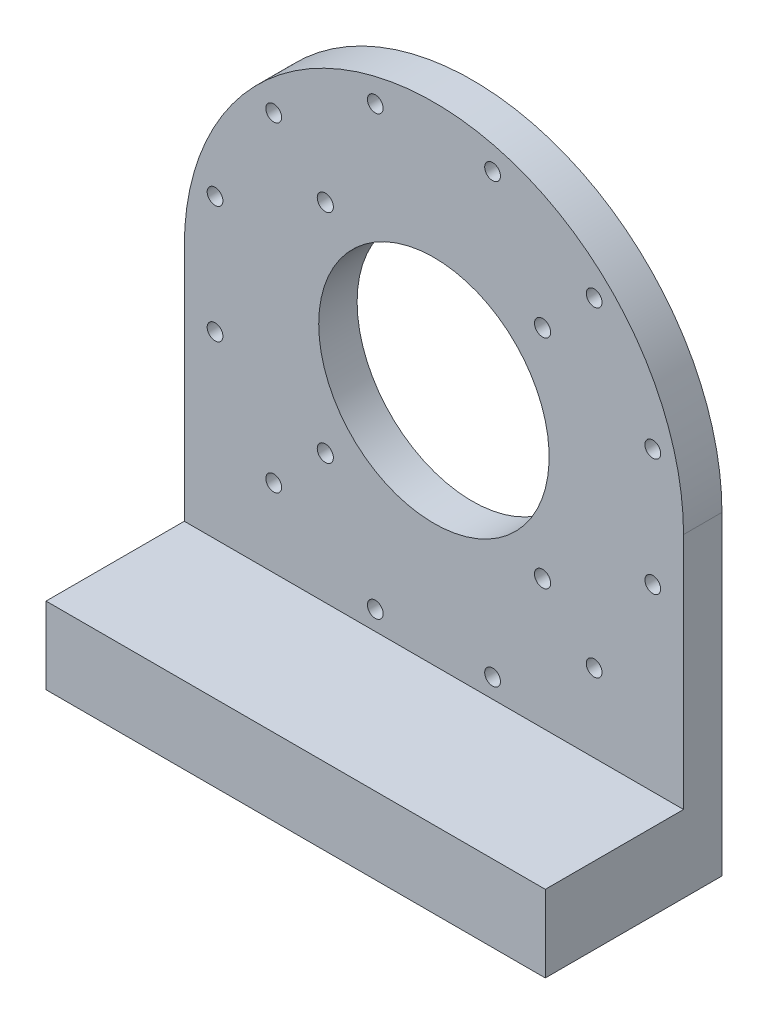
ISO-10303-21;
HEADER;
FILE_DESCRIPTION(('STEP AP214'),'2;1');
FILE_NAME('part.step','',(''),(''),'','','');
FILE_SCHEMA(('AUTOMOTIVE_DESIGN { 1 0 10303 214 1 1 1 1 }'));
ENDSEC;
DATA;
#1=APPLICATION_CONTEXT('core data for automotive mechanical design processes');
#2=APPLICATION_PROTOCOL_DEFINITION('international standard','automotive_design',2000,#1);
#3=PRODUCT_CONTEXT('',#1,'mechanical');
#4=PRODUCT('Part','Part','',(#3));
#5=PRODUCT_RELATED_PRODUCT_CATEGORY('part','',(#4));
#6=PRODUCT_DEFINITION_FORMATION('','',#4);
#7=PRODUCT_DEFINITION_CONTEXT('part definition',#1,'design');
#8=PRODUCT_DEFINITION('design','',#6,#7);
#9=PRODUCT_DEFINITION_SHAPE('','',#8);
#10=(LENGTH_UNIT() NAMED_UNIT(*) SI_UNIT(.MILLI.,.METRE.));
#11=(NAMED_UNIT(*) PLANE_ANGLE_UNIT() SI_UNIT($,.RADIAN.));
#12=(NAMED_UNIT(*) SI_UNIT($,.STERADIAN.) SOLID_ANGLE_UNIT());
#13=UNCERTAINTY_MEASURE_WITH_UNIT(LENGTH_MEASURE(1.E-05),#10,'distance_accuracy_value','');
#14=(GEOMETRIC_REPRESENTATION_CONTEXT(3) GLOBAL_UNCERTAINTY_ASSIGNED_CONTEXT((#13)) GLOBAL_UNIT_ASSIGNED_CONTEXT((#10,
#11,#12)) REPRESENTATION_CONTEXT('',''));
#15=CARTESIAN_POINT('',(0.,0.,0.));
#16=DIRECTION('',(0.,0.,1.));
#17=DIRECTION('',(1.,0.,0.));
#18=AXIS2_PLACEMENT_3D('',#15,#16,#17);
#19=CARTESIAN_POINT('',(0.,0.,-97.507071392975));
#20=DIRECTION('',(0.,0.,-1.));
#21=DIRECTION('',(-1.,0.,0.));
#22=AXIS2_PLACEMENT_3D('',#19,#20,#21);
#23=PLANE('',#22);
#24=CARTESIAN_POINT('',(47.3534927311799,88.9780084105045,-97.507071392975));
#25=DIRECTION('',(0.,0.,-1.));
#26=DIRECTION('',(-1.,0.,0.));
#27=AXIS2_PLACEMENT_3D('',#24,#25,#26);
#28=CIRCLE('',#27,2.05);
#29=CARTESIAN_POINT('',(45.3034927311799,88.9780084105045,-97.507071392975));
#30=VERTEX_POINT('',#29);
#31=EDGE_CURVE('E403',#30,#30,#28,.T.);
#32=ORIENTED_EDGE('',*,*,#31,.T.);
#33=EDGE_LOOP('',(#32));
#34=FACE_BOUND('',#33,.T.);
#35=CARTESIAN_POINT('',(32.0831690701311,62.5290319815478,-97.507071392975));
#36=DIRECTION('',(0.,0.,-1.));
#37=DIRECTION('',(-1.,0.,0.));
#38=AXIS2_PLACEMENT_3D('',#35,#36,#37);
#39=CIRCLE('',#38,2.05);
#40=CARTESIAN_POINT('',(30.0331690701311,62.5290319815478,-97.507071392975));
#41=VERTEX_POINT('',#40);
#42=EDGE_CURVE('E405',#41,#41,#39,.T.);
#43=ORIENTED_EDGE('',*,*,#42,.T.);
#44=EDGE_LOOP('',(#43));
#45=FACE_BOUND('',#44,.T.);
#46=CARTESIAN_POINT('',(32.0831690701306,31.9883846594511,-97.507071392975));
#47=DIRECTION('',(0.,0.,-1.));
#48=DIRECTION('',(-1.,0.,0.));
#49=AXIS2_PLACEMENT_3D('',#46,#47,#48);
#50=CIRCLE('',#49,2.05);
#51=CARTESIAN_POINT('',(30.0331690701306,31.9883846594511,-97.507071392975));
#52=VERTEX_POINT('',#51);
#53=EDGE_CURVE('E409',#52,#52,#50,.T.);
#54=ORIENTED_EDGE('',*,*,#53,.T.);
#55=EDGE_LOOP('',(#54));
#56=FACE_BOUND('',#55,.T.);
#57=CARTESIAN_POINT('',(47.3534927311785,5.53940823049389,-97.507071392975));
#58=DIRECTION('',(0.,0.,-1.));
#59=DIRECTION('',(-1.,0.,0.));
#60=AXIS2_PLACEMENT_3D('',#57,#58,#59);
#61=CIRCLE('',#60,2.04999999999999);
#62=CARTESIAN_POINT('',(45.3034927311785,5.53940823049389,-97.507071392975));
#63=VERTEX_POINT('',#62);
#64=EDGE_CURVE('E414',#63,#63,#61,.T.);
#65=ORIENTED_EDGE('',*,*,#64,.T.);
#66=EDGE_LOOP('',(#65));
#67=FACE_BOUND('',#66,.T.);
#68=CARTESIAN_POINT('',(73.8024691601352,-9.73091543055491,-97.507071392975));
#69=DIRECTION('',(0.,0.,-1.));
#70=DIRECTION('',(-1.,0.,0.));
#71=AXIS2_PLACEMENT_3D('',#68,#69,#70);
#72=CIRCLE('',#71,2.04999999999999);
#73=CARTESIAN_POINT('',(71.7524691601352,-9.73091543055491,-97.507071392975));
#74=VERTEX_POINT('',#73);
#75=EDGE_CURVE('E417',#74,#74,#72,.T.);
#76=ORIENTED_EDGE('',*,*,#75,.T.);
#77=EDGE_LOOP('',(#76));
#78=FACE_BOUND('',#77,.T.);
#79=CARTESIAN_POINT('',(104.343116482232,-9.73091543055543,-97.507071392975));
#80=DIRECTION('',(0.,0.,-1.));
#81=DIRECTION('',(-1.,0.,0.));
#82=AXIS2_PLACEMENT_3D('',#79,#80,#81);
#83=CIRCLE('',#82,2.04999999999999);
#84=CARTESIAN_POINT('',(102.293116482232,-9.73091543055543,-97.507071392975));
#85=VERTEX_POINT('',#84);
#86=EDGE_CURVE('E420',#85,#85,#83,.T.);
#87=ORIENTED_EDGE('',*,*,#86,.T.);
#88=EDGE_LOOP('',(#87));
#89=FACE_BOUND('',#88,.T.);
#90=CARTESIAN_POINT('',(130.792092911189,5.53940823049248,-97.507071392975));
#91=DIRECTION('',(0.,0.,-1.));
#92=DIRECTION('',(-1.,0.,0.));
#93=AXIS2_PLACEMENT_3D('',#90,#91,#92);
#94=CIRCLE('',#93,2.04999999999999);
#95=CARTESIAN_POINT('',(128.742092911189,5.53940823049248,-97.507071392975));
#96=VERTEX_POINT('',#95);
#97=EDGE_CURVE('E423',#96,#96,#94,.T.);
#98=ORIENTED_EDGE('',*,*,#97,.T.);
#99=EDGE_LOOP('',(#98));
#100=FACE_BOUND('',#99,.T.);
#101=CARTESIAN_POINT('',(146.062416572238,31.9883846594491,-97.507071392975));
#102=DIRECTION('',(0.,0.,-1.));
#103=DIRECTION('',(-1.,0.,0.));
#104=AXIS2_PLACEMENT_3D('',#101,#102,#103);
#105=CIRCLE('',#104,2.04999999999999);
#106=CARTESIAN_POINT('',(144.012416572238,31.9883846594491,-97.507071392975));
#107=VERTEX_POINT('',#106);
#108=EDGE_CURVE('E426',#107,#107,#105,.T.);
#109=ORIENTED_EDGE('',*,*,#108,.T.);
#110=EDGE_LOOP('',(#109));
#111=FACE_BOUND('',#110,.T.);
#112=CARTESIAN_POINT('',(146.062416572238,62.5290319815459,-97.507071392975));
#113=DIRECTION('',(0.,0.,-1.));
#114=DIRECTION('',(-1.,0.,0.));
#115=AXIS2_PLACEMENT_3D('',#112,#113,#114);
#116=CIRCLE('',#115,2.04999999999999);
#117=CARTESIAN_POINT('',(144.012416572238,62.5290319815459,-97.507071392975));
#118=VERTEX_POINT('',#117);
#119=EDGE_CURVE('E429',#118,#118,#116,.T.);
#120=ORIENTED_EDGE('',*,*,#119,.T.);
#121=EDGE_LOOP('',(#120));
#122=FACE_BOUND('',#121,.T.);
#123=CARTESIAN_POINT('',(130.792092911191,88.9780084105031,-97.507071392975));
#124=DIRECTION('',(0.,0.,-1.));
#125=DIRECTION('',(-1.,0.,0.));
#126=AXIS2_PLACEMENT_3D('',#123,#124,#125);
#127=CIRCLE('',#126,2.04999999999999);
#128=CARTESIAN_POINT('',(128.742092911191,88.9780084105031,-97.507071392975));
#129=VERTEX_POINT('',#128);
#130=EDGE_CURVE('E432',#129,#129,#127,.T.);
#131=ORIENTED_EDGE('',*,*,#130,.T.);
#132=EDGE_LOOP('',(#131));
#133=FACE_BOUND('',#132,.T.);
#134=CARTESIAN_POINT('',(104.343116482234,104.248332071552,-97.507071392975));
#135=DIRECTION('',(0.,0.,-1.));
#136=DIRECTION('',(-1.,0.,0.));
#137=AXIS2_PLACEMENT_3D('',#134,#135,#136);
#138=CIRCLE('',#137,2.04999999999999);
#139=CARTESIAN_POINT('',(102.293116482234,104.248332071552,-97.507071392975));
#140=VERTEX_POINT('',#139);
#141=EDGE_CURVE('E435',#140,#140,#138,.T.);
#142=ORIENTED_EDGE('',*,*,#141,.T.);
#143=EDGE_LOOP('',(#142));
#144=FACE_BOUND('',#143,.T.);
#145=CARTESIAN_POINT('',(73.8024691601371,104.248332071552,-97.507071392975));
#146=DIRECTION('',(0.,0.,-1.));
#147=DIRECTION('',(-1.,0.,0.));
#148=AXIS2_PLACEMENT_3D('',#145,#146,#147);
#149=CIRCLE('',#148,2.04999999999999);
#150=CARTESIAN_POINT('',(71.7524691601371,104.248332071552,-97.507071392975));
#151=VERTEX_POINT('',#150);
#152=EDGE_CURVE('E438',#151,#151,#149,.T.);
#153=ORIENTED_EDGE('',*,*,#152,.T.);
#154=EDGE_LOOP('',(#153));
#155=FACE_BOUND('',#154,.T.);
#156=CARTESIAN_POINT('',(89.0727928211845,47.2587083204985,-97.507071392975));
#157=DIRECTION('',(0.,0.,-1.));
#158=DIRECTION('',(-1.,0.,0.));
#159=AXIS2_PLACEMENT_3D('',#156,#157,#158);
#160=CIRCLE('',#159,30.);
#161=CARTESIAN_POINT('',(59.0727928211845,47.2587083204985,-97.507071392975));
#162=VERTEX_POINT('',#161);
#163=EDGE_CURVE('E125',#162,#162,#160,.T.);
#164=ORIENTED_EDGE('',*,*,#163,.T.);
#165=EDGE_LOOP('',(#164));
#166=FACE_BOUND('',#165,.T.);
#167=CARTESIAN_POINT('',(60.788521573722,18.9744370730372,-97.507071392975));
#168=DIRECTION('',(0.,0.,-1.));
#169=DIRECTION('',(-1.,0.,0.));
#170=AXIS2_PLACEMENT_3D('',#167,#168,#169);
#171=CIRCLE('',#170,2.1);
#172=CARTESIAN_POINT('',(58.688521573722,18.9744370730372,-97.507071392975));
#173=VERTEX_POINT('',#172);
#174=EDGE_CURVE('E137',#173,#173,#171,.F.);
#175=ORIENTED_EDGE('',*,*,#174,.F.);
#176=EDGE_LOOP('',(#175));
#177=FACE_BOUND('',#176,.T.);
#178=CARTESIAN_POINT('',(117.357064068646,75.5429795679604,-97.507071392975));
#179=DIRECTION('',(0.,0.,-1.));
#180=DIRECTION('',(-1.,0.,0.));
#181=AXIS2_PLACEMENT_3D('',#178,#179,#180);
#182=CIRCLE('',#181,2.1);
#183=CARTESIAN_POINT('',(115.257064068646,75.5429795679604,-97.507071392975));
#184=VERTEX_POINT('',#183);
#185=EDGE_CURVE('E164',#184,#184,#182,.F.);
#186=ORIENTED_EDGE('',*,*,#185,.F.);
#187=EDGE_LOOP('',(#186));
#188=FACE_BOUND('',#187,.T.);
#189=CARTESIAN_POINT('',(60.7885215737225,75.5429795679611,-97.507071392975));
#190=DIRECTION('',(0.,0.,-1.));
#191=DIRECTION('',(-1.,0.,0.));
#192=AXIS2_PLACEMENT_3D('',#189,#190,#191);
#193=CIRCLE('',#192,2.1);
#194=CARTESIAN_POINT('',(58.6885215737225,75.5429795679611,-97.507071392975));
#195=VERTEX_POINT('',#194);
#196=EDGE_CURVE('E161',#195,#195,#193,.F.);
#197=ORIENTED_EDGE('',*,*,#196,.F.);
#198=EDGE_LOOP('',(#197));
#199=FACE_BOUND('',#198,.T.);
#200=CARTESIAN_POINT('',(117.357064068646,18.9744370730369,-97.507071392975));
#201=DIRECTION('',(0.,0.,-1.));
#202=DIRECTION('',(-1.,0.,0.));
#203=AXIS2_PLACEMENT_3D('',#200,#201,#202);
#204=CIRCLE('',#203,2.1);
#205=CARTESIAN_POINT('',(115.257064068646,18.9744370730369,-97.507071392975));
#206=VERTEX_POINT('',#205);
#207=EDGE_CURVE('E158',#206,#206,#204,.F.);
#208=ORIENTED_EDGE('',*,*,#207,.F.);
#209=EDGE_LOOP('',(#208));
#210=FACE_BOUND('',#209,.T.);
#211=DIRECTION('',(-1.,0.,0.));
#212=VECTOR('',#211,1.);
#213=CARTESIAN_POINT('',(0.,-14.7412916795015,-97.507071392975));
#214=LINE('',#213,#212);
#215=CARTESIAN_POINT('',(154.072792821184,-14.7412916795015,-97.507071392975));
#216=VERTEX_POINT('',#215);
#217=CARTESIAN_POINT('',(24.0727928211845,-14.7412916795015,-97.507071392975));
#218=VERTEX_POINT('',#217);
#219=EDGE_CURVE('E56',#216,#218,#214,.T.);
#220=ORIENTED_EDGE('',*,*,#219,.F.);
#221=DIRECTION('',(0.,-1.,0.));
#222=VECTOR('',#221,1.);
#223=CARTESIAN_POINT('',(154.072792821184,0.,-97.507071392975));
#224=LINE('',#223,#222);
#225=CARTESIAN_POINT('',(154.072792821185,47.2587083204985,-97.507071392975));
#226=VERTEX_POINT('',#225);
#227=EDGE_CURVE('E156',#226,#216,#224,.T.);
#228=ORIENTED_EDGE('',*,*,#227,.F.);
#229=CARTESIAN_POINT('',(89.0727928211845,47.2587083204985,-97.507071392975));
#230=DIRECTION('',(0.,0.,-1.));
#231=DIRECTION('',(-1.,0.,0.));
#232=AXIS2_PLACEMENT_3D('',#229,#230,#231);
#233=CIRCLE('',#232,65.);
#234=CARTESIAN_POINT('',(24.0727928211845,47.2587083204985,-97.507071392975));
#235=VERTEX_POINT('',#234);
#236=EDGE_CURVE('E79',#235,#226,#233,.T.);
#237=ORIENTED_EDGE('',*,*,#236,.F.);
#238=DIRECTION('',(0.,-1.,0.));
#239=VECTOR('',#238,1.);
#240=CARTESIAN_POINT('',(24.0727928211845,0.,-97.507071392975));
#241=LINE('',#240,#239);
#242=EDGE_CURVE('E132',#235,#218,#241,.T.);
#243=ORIENTED_EDGE('',*,*,#242,.T.);
#244=EDGE_LOOP('',(#220,#228,#237,#243));
#245=FACE_BOUND('',#244,.T.);
#246=ADVANCED_FACE('F41',(#34,#45,#56,#67,#78,#89,#100,#111,#122,#133,#144,#155,#166,#177,#188,
#199,#210,#245),#23,.F.);
#247=CARTESIAN_POINT('',(24.0727928211845,0.,-107.507071392975));
#248=DIRECTION('',(-1.,0.,0.));
#249=DIRECTION('',(0.,-1.,0.));
#250=AXIS2_PLACEMENT_3D('',#247,#248,#249);
#251=PLANE('',#250);
#252=ORIENTED_EDGE('',*,*,#242,.F.);
#253=DIRECTION('',(0.,0.,1.));
#254=VECTOR('',#253,1.);
#255=CARTESIAN_POINT('',(24.0727928211845,47.2587083204985,-107.507071392975));
#256=LINE('',#255,#254);
#257=CARTESIAN_POINT('',(24.0727928211845,47.2587083204985,-107.507071392975));
#258=VERTEX_POINT('',#257);
#259=EDGE_CURVE('E11',#258,#235,#256,.T.);
#260=ORIENTED_EDGE('',*,*,#259,.F.);
#261=DIRECTION('',(0.,-1.,0.));
#262=VECTOR('',#261,1.);
#263=CARTESIAN_POINT('',(24.0727928211845,0.,-107.507071392975));
#264=LINE('',#263,#262);
#265=CARTESIAN_POINT('',(24.0727928211845,-34.7412916795015,-107.507071392975));
#266=VERTEX_POINT('',#265);
#267=EDGE_CURVE('E134',#258,#266,#264,.T.);
#268=ORIENTED_EDGE('',*,*,#267,.T.);
#269=DIRECTION('',(0.,0.,1.));
#270=VECTOR('',#269,1.);
#271=CARTESIAN_POINT('',(24.0727928211845,-34.7412916795015,-107.507071392975));
#272=LINE('',#271,#270);
#273=CARTESIAN_POINT('',(24.0727928211845,-34.7412916795015,-61.507071392975));
#274=VERTEX_POINT('',#273);
#275=EDGE_CURVE('E123',#266,#274,#272,.T.);
#276=ORIENTED_EDGE('',*,*,#275,.T.);
#277=DIRECTION('',(0.,-1.,0.));
#278=VECTOR('',#277,1.);
#279=CARTESIAN_POINT('',(24.0727928211845,0.,-61.507071392975));
#280=LINE('',#279,#278);
#281=CARTESIAN_POINT('',(24.0727928211845,-14.7412916795015,-61.507071392975));
#282=VERTEX_POINT('',#281);
#283=EDGE_CURVE('E110',#282,#274,#280,.T.);
#284=ORIENTED_EDGE('',*,*,#283,.F.);
#285=DIRECTION('',(0.,0.,-1.));
#286=VECTOR('',#285,1.);
#287=CARTESIAN_POINT('',(24.0727928211845,-14.7412916795015,-61.507071392975));
#288=LINE('',#287,#286);
#289=EDGE_CURVE('E118',#282,#218,#288,.T.);
#290=ORIENTED_EDGE('',*,*,#289,.T.);
#291=EDGE_LOOP('',(#252,#260,#268,#276,#284,#290));
#292=FACE_BOUND('',#291,.T.);
#293=ADVANCED_FACE('F43',(#292),#251,.T.);
#294=CARTESIAN_POINT('',(89.0727928211845,47.2587083204985,-107.507071392975));
#295=DIRECTION('',(0.,0.,1.));
#296=DIRECTION('',(1.,0.,0.));
#297=AXIS2_PLACEMENT_3D('',#294,#295,#296);
#298=CYLINDRICAL_SURFACE('',#297,65.);
#299=ORIENTED_EDGE('',*,*,#236,.T.);
#300=DIRECTION('',(0.,0.,1.));
#301=VECTOR('',#300,1.);
#302=CARTESIAN_POINT('',(154.072792821185,47.2587083204985,-107.507071392975));
#303=LINE('',#302,#301);
#304=CARTESIAN_POINT('',(154.072792821185,47.2587083204985,-107.507071392975));
#305=VERTEX_POINT('',#304);
#306=EDGE_CURVE('E49',#305,#226,#303,.T.);
#307=ORIENTED_EDGE('',*,*,#306,.F.);
#308=CARTESIAN_POINT('',(89.0727928211845,47.2587083204985,-107.507071392975));
#309=DIRECTION('',(0.,0.,-1.));
#310=DIRECTION('',(-1.,0.,0.));
#311=AXIS2_PLACEMENT_3D('',#308,#309,#310);
#312=CIRCLE('',#311,65.);
#313=EDGE_CURVE('E136',#258,#305,#312,.T.);
#314=ORIENTED_EDGE('',*,*,#313,.F.);
#315=ORIENTED_EDGE('',*,*,#259,.T.);
#316=EDGE_LOOP('',(#299,#307,#314,#315));
#317=FACE_BOUND('',#316,.T.);
#318=ADVANCED_FACE('F183',(#317),#298,.T.);
#319=CARTESIAN_POINT('',(154.072792821184,0.,-107.507071392975));
#320=DIRECTION('',(-1.,0.,0.));
#321=DIRECTION('',(0.,-1.,0.));
#322=AXIS2_PLACEMENT_3D('',#319,#320,#321);
#323=PLANE('',#322);
#324=ORIENTED_EDGE('',*,*,#227,.T.);
#325=DIRECTION('',(0.,0.,-1.));
#326=VECTOR('',#325,1.);
#327=CARTESIAN_POINT('',(154.072792821184,-14.7412916795015,-61.507071392975));
#328=LINE('',#327,#326);
#329=CARTESIAN_POINT('',(154.072792821184,-14.7412916795015,-61.507071392975));
#330=VERTEX_POINT('',#329);
#331=EDGE_CURVE('E120',#330,#216,#328,.T.);
#332=ORIENTED_EDGE('',*,*,#331,.F.);
#333=DIRECTION('',(0.,-1.,0.));
#334=VECTOR('',#333,1.);
#335=CARTESIAN_POINT('',(154.072792821184,0.,-61.507071392975));
#336=LINE('',#335,#334);
#337=CARTESIAN_POINT('',(154.072792821184,-34.7412916795015,-61.507071392975));
#338=VERTEX_POINT('',#337);
#339=EDGE_CURVE('E113',#330,#338,#336,.T.);
#340=ORIENTED_EDGE('',*,*,#339,.T.);
#341=DIRECTION('',(0.,0.,1.));
#342=VECTOR('',#341,1.);
#343=CARTESIAN_POINT('',(154.072792821184,-34.7412916795015,-107.507071392975));
#344=LINE('',#343,#342);
#345=CARTESIAN_POINT('',(154.072792821184,-34.7412916795015,-107.507071392975));
#346=VERTEX_POINT('',#345);
#347=EDGE_CURVE('E170',#346,#338,#344,.T.);
#348=ORIENTED_EDGE('',*,*,#347,.F.);
#349=DIRECTION('',(0.,-1.,0.));
#350=VECTOR('',#349,1.);
#351=CARTESIAN_POINT('',(154.072792821184,0.,-107.507071392975));
#352=LINE('',#351,#350);
#353=EDGE_CURVE('E139',#305,#346,#352,.T.);
#354=ORIENTED_EDGE('',*,*,#353,.F.);
#355=ORIENTED_EDGE('',*,*,#306,.T.);
#356=EDGE_LOOP('',(#324,#332,#340,#348,#354,#355));
#357=FACE_BOUND('',#356,.T.);
#358=ADVANCED_FACE('F173',(#357),#323,.F.);
#359=CARTESIAN_POINT('',(117.357064068646,75.5429795679604,-107.507071392975));
#360=DIRECTION('',(0.,0.,1.));
#361=DIRECTION('',(1.,0.,0.));
#362=AXIS2_PLACEMENT_3D('',#359,#360,#361);
#363=CYLINDRICAL_SURFACE('',#362,2.1);
#364=CARTESIAN_POINT('',(117.357064068646,75.5429795679604,-107.507071392975));
#365=DIRECTION('',(0.,0.,-1.));
#366=DIRECTION('',(-1.,0.,0.));
#367=AXIS2_PLACEMENT_3D('',#364,#365,#366);
#368=CIRCLE('',#367,2.1);
#369=CARTESIAN_POINT('',(115.257064068646,75.5429795679604,-107.507071392975));
#370=VERTEX_POINT('',#369);
#371=EDGE_CURVE('E148',#370,#370,#368,.F.);
#372=ORIENTED_EDGE('',*,*,#371,.F.);
#373=EDGE_LOOP('',(#372));
#374=FACE_BOUND('',#373,.T.);
#375=ORIENTED_EDGE('',*,*,#185,.T.);
#376=EDGE_LOOP('',(#375));
#377=FACE_BOUND('',#376,.T.);
#378=ADVANCED_FACE('F195',(#374,#377),#363,.F.);
#379=CARTESIAN_POINT('',(60.7885215737225,75.5429795679611,-107.507071392975));
#380=DIRECTION('',(0.,0.,1.));
#381=DIRECTION('',(1.,0.,0.));
#382=AXIS2_PLACEMENT_3D('',#379,#380,#381);
#383=CYLINDRICAL_SURFACE('',#382,2.1);
#384=CARTESIAN_POINT('',(60.7885215737225,75.5429795679611,-107.507071392975));
#385=DIRECTION('',(0.,0.,-1.));
#386=DIRECTION('',(-1.,0.,0.));
#387=AXIS2_PLACEMENT_3D('',#384,#385,#386);
#388=CIRCLE('',#387,2.1);
#389=CARTESIAN_POINT('',(58.6885215737225,75.5429795679611,-107.507071392975));
#390=VERTEX_POINT('',#389);
#391=EDGE_CURVE('E145',#390,#390,#388,.F.);
#392=ORIENTED_EDGE('',*,*,#391,.F.);
#393=EDGE_LOOP('',(#392));
#394=FACE_BOUND('',#393,.T.);
#395=ORIENTED_EDGE('',*,*,#196,.T.);
#396=EDGE_LOOP('',(#395));
#397=FACE_BOUND('',#396,.T.);
#398=ADVANCED_FACE('F198',(#394,#397),#383,.F.);
#399=CARTESIAN_POINT('',(117.357064068646,18.9744370730369,-107.507071392975));
#400=DIRECTION('',(0.,0.,1.));
#401=DIRECTION('',(1.,0.,0.));
#402=AXIS2_PLACEMENT_3D('',#399,#400,#401);
#403=CYLINDRICAL_SURFACE('',#402,2.1);
#404=CARTESIAN_POINT('',(117.357064068646,18.9744370730369,-107.507071392975));
#405=DIRECTION('',(0.,0.,-1.));
#406=DIRECTION('',(-1.,0.,0.));
#407=AXIS2_PLACEMENT_3D('',#404,#405,#406);
#408=CIRCLE('',#407,2.1);
#409=CARTESIAN_POINT('',(115.257064068646,18.9744370730369,-107.507071392975));
#410=VERTEX_POINT('',#409);
#411=EDGE_CURVE('E142',#410,#410,#408,.F.);
#412=ORIENTED_EDGE('',*,*,#411,.F.);
#413=EDGE_LOOP('',(#412));
#414=FACE_BOUND('',#413,.T.);
#415=ORIENTED_EDGE('',*,*,#207,.T.);
#416=EDGE_LOOP('',(#415));
#417=FACE_BOUND('',#416,.T.);
#418=ADVANCED_FACE('F202',(#414,#417),#403,.F.);
#419=CARTESIAN_POINT('',(0.,-34.7412916795015,-107.507071392975));
#420=DIRECTION('',(0.,1.,0.));
#421=DIRECTION('',(0.,0.,1.));
#422=AXIS2_PLACEMENT_3D('',#419,#420,#421);
#423=PLANE('',#422);
#424=ORIENTED_EDGE('',*,*,#347,.T.);
#425=DIRECTION('',(-1.,0.,0.));
#426=VECTOR('',#425,1.);
#427=CARTESIAN_POINT('',(0.,-34.7412916795015,-61.507071392975));
#428=LINE('',#427,#426);
#429=EDGE_CURVE('E121',#338,#274,#428,.T.);
#430=ORIENTED_EDGE('',*,*,#429,.T.);
#431=ORIENTED_EDGE('',*,*,#275,.F.);
#432=DIRECTION('',(-1.,0.,0.));
#433=VECTOR('',#432,1.);
#434=CARTESIAN_POINT('',(0.,-34.7412916795015,-107.507071392975));
#435=LINE('',#434,#433);
#436=EDGE_CURVE('E65',#346,#266,#435,.T.);
#437=ORIENTED_EDGE('',*,*,#436,.F.);
#438=EDGE_LOOP('',(#424,#430,#431,#437));
#439=FACE_BOUND('',#438,.T.);
#440=ADVANCED_FACE('F193',(#439),#423,.F.);
#441=CARTESIAN_POINT('',(60.788521573722,18.9744370730372,-107.507071392975));
#442=DIRECTION('',(0.,0.,1.));
#443=DIRECTION('',(1.,0.,0.));
#444=AXIS2_PLACEMENT_3D('',#441,#442,#443);
#445=CYLINDRICAL_SURFACE('',#444,2.1);
#446=CARTESIAN_POINT('',(60.788521573722,18.9744370730372,-107.507071392975));
#447=DIRECTION('',(0.,0.,-1.));
#448=DIRECTION('',(-1.,0.,0.));
#449=AXIS2_PLACEMENT_3D('',#446,#447,#448);
#450=CIRCLE('',#449,2.1);
#451=CARTESIAN_POINT('',(58.688521573722,18.9744370730372,-107.507071392975));
#452=VERTEX_POINT('',#451);
#453=EDGE_CURVE('E151',#452,#452,#450,.F.);
#454=ORIENTED_EDGE('',*,*,#453,.F.);
#455=EDGE_LOOP('',(#454));
#456=FACE_BOUND('',#455,.T.);
#457=ORIENTED_EDGE('',*,*,#174,.T.);
#458=EDGE_LOOP('',(#457));
#459=FACE_BOUND('',#458,.T.);
#460=ADVANCED_FACE('F190',(#456,#459),#445,.F.);
#461=CARTESIAN_POINT('',(0.,0.,-107.507071392975));
#462=DIRECTION('',(0.,0.,-1.));
#463=DIRECTION('',(-1.,0.,0.));
#464=AXIS2_PLACEMENT_3D('',#461,#462,#463);
#465=PLANE('',#464);
#466=CARTESIAN_POINT('',(47.3534927311799,88.9780084105045,-107.507071392975));
#467=DIRECTION('',(0.,0.,-1.));
#468=DIRECTION('',(-1.,0.,0.));
#469=AXIS2_PLACEMENT_3D('',#466,#467,#468);
#470=CIRCLE('',#469,2.05);
#471=CARTESIAN_POINT('',(45.3034927311799,88.9780084105045,-107.507071392975));
#472=VERTEX_POINT('',#471);
#473=EDGE_CURVE('E401',#472,#472,#470,.T.);
#474=ORIENTED_EDGE('',*,*,#473,.F.);
#475=EDGE_LOOP('',(#474));
#476=FACE_BOUND('',#475,.T.);
#477=CARTESIAN_POINT('',(32.0831690701311,62.5290319815478,-107.507071392975));
#478=DIRECTION('',(0.,0.,-1.));
#479=DIRECTION('',(-1.,0.,0.));
#480=AXIS2_PLACEMENT_3D('',#477,#478,#479);
#481=CIRCLE('',#480,2.05);
#482=CARTESIAN_POINT('',(30.0331690701311,62.5290319815478,-107.507071392975));
#483=VERTEX_POINT('',#482);
#484=EDGE_CURVE('E463',#483,#483,#481,.T.);
#485=ORIENTED_EDGE('',*,*,#484,.F.);
#486=EDGE_LOOP('',(#485));
#487=FACE_BOUND('',#486,.T.);
#488=CARTESIAN_POINT('',(32.0831690701306,31.9883846594511,-107.507071392975));
#489=DIRECTION('',(0.,0.,-1.));
#490=DIRECTION('',(-1.,0.,0.));
#491=AXIS2_PLACEMENT_3D('',#488,#489,#490);
#492=CIRCLE('',#491,2.05);
#493=CARTESIAN_POINT('',(30.0331690701306,31.9883846594511,-107.507071392975));
#494=VERTEX_POINT('',#493);
#495=EDGE_CURVE('E460',#494,#494,#492,.T.);
#496=ORIENTED_EDGE('',*,*,#495,.F.);
#497=EDGE_LOOP('',(#496));
#498=FACE_BOUND('',#497,.T.);
#499=CARTESIAN_POINT('',(47.3534927311785,5.53940823049389,-107.507071392975));
#500=DIRECTION('',(0.,0.,-1.));
#501=DIRECTION('',(-1.,0.,0.));
#502=AXIS2_PLACEMENT_3D('',#499,#500,#501);
#503=CIRCLE('',#502,2.04999999999999);
#504=CARTESIAN_POINT('',(45.3034927311785,5.53940823049389,-107.507071392975));
#505=VERTEX_POINT('',#504);
#506=EDGE_CURVE('E457',#505,#505,#503,.T.);
#507=ORIENTED_EDGE('',*,*,#506,.F.);
#508=EDGE_LOOP('',(#507));
#509=FACE_BOUND('',#508,.T.);
#510=CARTESIAN_POINT('',(73.8024691601352,-9.73091543055491,-107.507071392975));
#511=DIRECTION('',(0.,0.,-1.));
#512=DIRECTION('',(-1.,0.,0.));
#513=AXIS2_PLACEMENT_3D('',#510,#511,#512);
#514=CIRCLE('',#513,2.04999999999999);
#515=CARTESIAN_POINT('',(71.7524691601352,-9.73091543055491,-107.507071392975));
#516=VERTEX_POINT('',#515);
#517=EDGE_CURVE('E454',#516,#516,#514,.T.);
#518=ORIENTED_EDGE('',*,*,#517,.F.);
#519=EDGE_LOOP('',(#518));
#520=FACE_BOUND('',#519,.T.);
#521=CARTESIAN_POINT('',(104.343116482232,-9.73091543055543,-107.507071392975));
#522=DIRECTION('',(0.,0.,-1.));
#523=DIRECTION('',(-1.,0.,0.));
#524=AXIS2_PLACEMENT_3D('',#521,#522,#523);
#525=CIRCLE('',#524,2.04999999999999);
#526=CARTESIAN_POINT('',(102.293116482232,-9.73091543055543,-107.507071392975));
#527=VERTEX_POINT('',#526);
#528=EDGE_CURVE('E451',#527,#527,#525,.T.);
#529=ORIENTED_EDGE('',*,*,#528,.F.);
#530=EDGE_LOOP('',(#529));
#531=FACE_BOUND('',#530,.T.);
#532=CARTESIAN_POINT('',(130.792092911189,5.53940823049248,-107.507071392975));
#533=DIRECTION('',(0.,0.,-1.));
#534=DIRECTION('',(-1.,0.,0.));
#535=AXIS2_PLACEMENT_3D('',#532,#533,#534);
#536=CIRCLE('',#535,2.04999999999999);
#537=CARTESIAN_POINT('',(128.742092911189,5.53940823049248,-107.507071392975));
#538=VERTEX_POINT('',#537);
#539=EDGE_CURVE('E447',#538,#538,#536,.T.);
#540=ORIENTED_EDGE('',*,*,#539,.F.);
#541=EDGE_LOOP('',(#540));
#542=FACE_BOUND('',#541,.T.);
#543=CARTESIAN_POINT('',(146.062416572238,31.9883846594491,-107.507071392975));
#544=DIRECTION('',(0.,0.,-1.));
#545=DIRECTION('',(-1.,0.,0.));
#546=AXIS2_PLACEMENT_3D('',#543,#544,#545);
#547=CIRCLE('',#546,2.04999999999999);
#548=CARTESIAN_POINT('',(144.012416572238,31.9883846594491,-107.507071392975));
#549=VERTEX_POINT('',#548);
#550=EDGE_CURVE('E444',#549,#549,#547,.T.);
#551=ORIENTED_EDGE('',*,*,#550,.F.);
#552=EDGE_LOOP('',(#551));
#553=FACE_BOUND('',#552,.T.);
#554=CARTESIAN_POINT('',(146.062416572238,62.5290319815459,-107.507071392975));
#555=DIRECTION('',(0.,0.,-1.));
#556=DIRECTION('',(-1.,0.,0.));
#557=AXIS2_PLACEMENT_3D('',#554,#555,#556);
#558=CIRCLE('',#557,2.04999999999999);
#559=CARTESIAN_POINT('',(144.012416572238,62.5290319815459,-107.507071392975));
#560=VERTEX_POINT('',#559);
#561=EDGE_CURVE('E448',#560,#560,#558,.T.);
#562=ORIENTED_EDGE('',*,*,#561,.F.);
#563=EDGE_LOOP('',(#562));
#564=FACE_BOUND('',#563,.T.);
#565=CARTESIAN_POINT('',(130.792092911191,88.9780084105031,-107.507071392975));
#566=DIRECTION('',(0.,0.,-1.));
#567=DIRECTION('',(-1.,0.,0.));
#568=AXIS2_PLACEMENT_3D('',#565,#566,#567);
#569=CIRCLE('',#568,2.04999999999999);
#570=CARTESIAN_POINT('',(128.742092911191,88.9780084105031,-107.507071392975));
#571=VERTEX_POINT('',#570);
#572=EDGE_CURVE('E470',#571,#571,#569,.T.);
#573=ORIENTED_EDGE('',*,*,#572,.F.);
#574=EDGE_LOOP('',(#573));
#575=FACE_BOUND('',#574,.T.);
#576=CARTESIAN_POINT('',(104.343116482234,104.248332071552,-107.507071392975));
#577=DIRECTION('',(0.,0.,-1.));
#578=DIRECTION('',(-1.,0.,0.));
#579=AXIS2_PLACEMENT_3D('',#576,#577,#578);
#580=CIRCLE('',#579,2.04999999999999);
#581=CARTESIAN_POINT('',(102.293116482234,104.248332071552,-107.507071392975));
#582=VERTEX_POINT('',#581);
#583=EDGE_CURVE('E467',#582,#582,#580,.T.);
#584=ORIENTED_EDGE('',*,*,#583,.F.);
#585=EDGE_LOOP('',(#584));
#586=FACE_BOUND('',#585,.T.);
#587=CARTESIAN_POINT('',(73.8024691601371,104.248332071552,-107.507071392975));
#588=DIRECTION('',(0.,0.,-1.));
#589=DIRECTION('',(-1.,0.,0.));
#590=AXIS2_PLACEMENT_3D('',#587,#588,#589);
#591=CIRCLE('',#590,2.04999999999999);
#592=CARTESIAN_POINT('',(71.7524691601371,104.248332071552,-107.507071392975));
#593=VERTEX_POINT('',#592);
#594=EDGE_CURVE('E441',#593,#593,#591,.T.);
#595=ORIENTED_EDGE('',*,*,#594,.F.);
#596=EDGE_LOOP('',(#595));
#597=FACE_BOUND('',#596,.T.);
#598=CARTESIAN_POINT('',(89.0727928211845,47.2587083204985,-107.507071392975));
#599=DIRECTION('',(0.,0.,-1.));
#600=DIRECTION('',(-1.,0.,0.));
#601=AXIS2_PLACEMENT_3D('',#598,#599,#600);
#602=CIRCLE('',#601,30.);
#603=CARTESIAN_POINT('',(59.0727928211845,47.2587083204985,-107.507071392975));
#604=VERTEX_POINT('',#603);
#605=EDGE_CURVE('E404',#604,#604,#602,.T.);
#606=ORIENTED_EDGE('',*,*,#605,.F.);
#607=EDGE_LOOP('',(#606));
#608=FACE_BOUND('',#607,.T.);
#609=ORIENTED_EDGE('',*,*,#267,.F.);
#610=ORIENTED_EDGE('',*,*,#313,.T.);
#611=ORIENTED_EDGE('',*,*,#353,.T.);
#612=ORIENTED_EDGE('',*,*,#436,.T.);
#613=EDGE_LOOP('',(#609,#610,#611,#612));
#614=FACE_BOUND('',#613,.T.);
#615=ORIENTED_EDGE('',*,*,#411,.T.);
#616=EDGE_LOOP('',(#615));
#617=FACE_BOUND('',#616,.T.);
#618=ORIENTED_EDGE('',*,*,#391,.T.);
#619=EDGE_LOOP('',(#618));
#620=FACE_BOUND('',#619,.T.);
#621=ORIENTED_EDGE('',*,*,#371,.T.);
#622=EDGE_LOOP('',(#621));
#623=FACE_BOUND('',#622,.T.);
#624=ORIENTED_EDGE('',*,*,#453,.T.);
#625=EDGE_LOOP('',(#624));
#626=FACE_BOUND('',#625,.T.);
#627=ADVANCED_FACE('F188',(#476,#487,#498,#509,#520,#531,#542,#553,#564,#575,#586,#597,#608,
#614,#617,#620,#623,#626),#465,.T.);
#628=CARTESIAN_POINT('',(0.,-14.7412916795015,-61.507071392975));
#629=DIRECTION('',(0.,-1.,0.));
#630=DIRECTION('',(0.,0.,-1.));
#631=AXIS2_PLACEMENT_3D('',#628,#629,#630);
#632=PLANE('',#631);
#633=ORIENTED_EDGE('',*,*,#219,.T.);
#634=ORIENTED_EDGE('',*,*,#289,.F.);
#635=DIRECTION('',(-1.,0.,0.));
#636=VECTOR('',#635,1.);
#637=CARTESIAN_POINT('',(0.,-14.7412916795015,-61.507071392975));
#638=LINE('',#637,#636);
#639=EDGE_CURVE('E105',#330,#282,#638,.T.);
#640=ORIENTED_EDGE('',*,*,#639,.F.);
#641=ORIENTED_EDGE('',*,*,#331,.T.);
#642=EDGE_LOOP('',(#633,#634,#640,#641));
#643=FACE_BOUND('',#642,.T.);
#644=ADVANCED_FACE('F119',(#643),#632,.F.);
#645=CARTESIAN_POINT('',(0.,0.,-61.507071392975));
#646=DIRECTION('',(0.,0.,-1.));
#647=DIRECTION('',(-1.,0.,0.));
#648=AXIS2_PLACEMENT_3D('',#645,#646,#647);
#649=PLANE('',#648);
#650=ORIENTED_EDGE('',*,*,#283,.T.);
#651=ORIENTED_EDGE('',*,*,#429,.F.);
#652=ORIENTED_EDGE('',*,*,#339,.F.);
#653=ORIENTED_EDGE('',*,*,#639,.T.);
#654=EDGE_LOOP('',(#650,#651,#652,#653));
#655=FACE_BOUND('',#654,.T.);
#656=ADVANCED_FACE('F107',(#655),#649,.F.);
#657=CARTESIAN_POINT('',(89.0727928211845,47.2587083204985,-71.507071392975));
#658=DIRECTION('',(0.,0.,-1.));
#659=DIRECTION('',(-1.,0.,0.));
#660=AXIS2_PLACEMENT_3D('',#657,#658,#659);
#661=CYLINDRICAL_SURFACE('',#660,30.);
#662=ORIENTED_EDGE('',*,*,#605,.T.);
#663=EDGE_LOOP('',(#662));
#664=FACE_BOUND('',#663,.T.);
#665=ORIENTED_EDGE('',*,*,#163,.F.);
#666=EDGE_LOOP('',(#665));
#667=FACE_BOUND('',#666,.T.);
#668=ADVANCED_FACE('F265',(#664,#667),#661,.F.);
#669=CARTESIAN_POINT('',(73.8024691601371,104.248332071552,-61.507071392975));
#670=DIRECTION('',(0.,0.,-1.));
#671=DIRECTION('',(-1.,0.,0.));
#672=AXIS2_PLACEMENT_3D('',#669,#670,#671);
#673=CYLINDRICAL_SURFACE('',#672,2.04999999999999);
#674=ORIENTED_EDGE('',*,*,#594,.T.);
#675=EDGE_LOOP('',(#674));
#676=FACE_BOUND('',#675,.T.);
#677=ORIENTED_EDGE('',*,*,#152,.F.);
#678=EDGE_LOOP('',(#677));
#679=FACE_BOUND('',#678,.T.);
#680=ADVANCED_FACE('F272',(#676,#679),#673,.F.);
#681=CARTESIAN_POINT('',(104.343116482234,104.248332071552,-61.507071392975));
#682=DIRECTION('',(0.,0.,-1.));
#683=DIRECTION('',(-1.,0.,0.));
#684=AXIS2_PLACEMENT_3D('',#681,#682,#683);
#685=CYLINDRICAL_SURFACE('',#684,2.04999999999999);
#686=ORIENTED_EDGE('',*,*,#583,.T.);
#687=EDGE_LOOP('',(#686));
#688=FACE_BOUND('',#687,.T.);
#689=ORIENTED_EDGE('',*,*,#141,.F.);
#690=EDGE_LOOP('',(#689));
#691=FACE_BOUND('',#690,.T.);
#692=ADVANCED_FACE('F285',(#688,#691),#685,.F.);
#693=CARTESIAN_POINT('',(130.792092911191,88.9780084105031,-61.507071392975));
#694=DIRECTION('',(0.,0.,-1.));
#695=DIRECTION('',(-1.,0.,0.));
#696=AXIS2_PLACEMENT_3D('',#693,#694,#695);
#697=CYLINDRICAL_SURFACE('',#696,2.04999999999999);
#698=ORIENTED_EDGE('',*,*,#572,.T.);
#699=EDGE_LOOP('',(#698));
#700=FACE_BOUND('',#699,.T.);
#701=ORIENTED_EDGE('',*,*,#130,.F.);
#702=EDGE_LOOP('',(#701));
#703=FACE_BOUND('',#702,.T.);
#704=ADVANCED_FACE('F295',(#700,#703),#697,.F.);
#705=CARTESIAN_POINT('',(146.062416572238,62.5290319815459,-61.507071392975));
#706=DIRECTION('',(0.,0.,-1.));
#707=DIRECTION('',(-1.,0.,0.));
#708=AXIS2_PLACEMENT_3D('',#705,#706,#707);
#709=CYLINDRICAL_SURFACE('',#708,2.04999999999999);
#710=ORIENTED_EDGE('',*,*,#561,.T.);
#711=EDGE_LOOP('',(#710));
#712=FACE_BOUND('',#711,.T.);
#713=ORIENTED_EDGE('',*,*,#119,.F.);
#714=EDGE_LOOP('',(#713));
#715=FACE_BOUND('',#714,.T.);
#716=ADVANCED_FACE('F305',(#712,#715),#709,.F.);
#717=CARTESIAN_POINT('',(146.062416572238,31.9883846594491,-61.507071392975));
#718=DIRECTION('',(0.,0.,-1.));
#719=DIRECTION('',(-1.,0.,0.));
#720=AXIS2_PLACEMENT_3D('',#717,#718,#719);
#721=CYLINDRICAL_SURFACE('',#720,2.04999999999999);
#722=ORIENTED_EDGE('',*,*,#550,.T.);
#723=EDGE_LOOP('',(#722));
#724=FACE_BOUND('',#723,.T.);
#725=ORIENTED_EDGE('',*,*,#108,.F.);
#726=EDGE_LOOP('',(#725));
#727=FACE_BOUND('',#726,.T.);
#728=ADVANCED_FACE('F315',(#724,#727),#721,.F.);
#729=CARTESIAN_POINT('',(130.792092911189,5.53940823049248,-61.507071392975));
#730=DIRECTION('',(0.,0.,-1.));
#731=DIRECTION('',(-1.,0.,0.));
#732=AXIS2_PLACEMENT_3D('',#729,#730,#731);
#733=CYLINDRICAL_SURFACE('',#732,2.04999999999999);
#734=ORIENTED_EDGE('',*,*,#539,.T.);
#735=EDGE_LOOP('',(#734));
#736=FACE_BOUND('',#735,.T.);
#737=ORIENTED_EDGE('',*,*,#97,.F.);
#738=EDGE_LOOP('',(#737));
#739=FACE_BOUND('',#738,.T.);
#740=ADVANCED_FACE('F325',(#736,#739),#733,.F.);
#741=CARTESIAN_POINT('',(104.343116482232,-9.73091543055543,-61.507071392975));
#742=DIRECTION('',(0.,0.,-1.));
#743=DIRECTION('',(-1.,0.,0.));
#744=AXIS2_PLACEMENT_3D('',#741,#742,#743);
#745=CYLINDRICAL_SURFACE('',#744,2.04999999999999);
#746=ORIENTED_EDGE('',*,*,#528,.T.);
#747=EDGE_LOOP('',(#746));
#748=FACE_BOUND('',#747,.T.);
#749=ORIENTED_EDGE('',*,*,#86,.F.);
#750=EDGE_LOOP('',(#749));
#751=FACE_BOUND('',#750,.T.);
#752=ADVANCED_FACE('F335',(#748,#751),#745,.F.);
#753=CARTESIAN_POINT('',(73.8024691601352,-9.73091543055491,-61.507071392975));
#754=DIRECTION('',(0.,0.,-1.));
#755=DIRECTION('',(-1.,0.,0.));
#756=AXIS2_PLACEMENT_3D('',#753,#754,#755);
#757=CYLINDRICAL_SURFACE('',#756,2.04999999999999);
#758=ORIENTED_EDGE('',*,*,#517,.T.);
#759=EDGE_LOOP('',(#758));
#760=FACE_BOUND('',#759,.T.);
#761=ORIENTED_EDGE('',*,*,#75,.F.);
#762=EDGE_LOOP('',(#761));
#763=FACE_BOUND('',#762,.T.);
#764=ADVANCED_FACE('F345',(#760,#763),#757,.F.);
#765=CARTESIAN_POINT('',(47.3534927311785,5.53940823049389,-61.507071392975));
#766=DIRECTION('',(0.,0.,-1.));
#767=DIRECTION('',(-1.,0.,0.));
#768=AXIS2_PLACEMENT_3D('',#765,#766,#767);
#769=CYLINDRICAL_SURFACE('',#768,2.04999999999999);
#770=ORIENTED_EDGE('',*,*,#506,.T.);
#771=EDGE_LOOP('',(#770));
#772=FACE_BOUND('',#771,.T.);
#773=ORIENTED_EDGE('',*,*,#64,.F.);
#774=EDGE_LOOP('',(#773));
#775=FACE_BOUND('',#774,.T.);
#776=ADVANCED_FACE('F355',(#772,#775),#769,.F.);
#777=CARTESIAN_POINT('',(32.0831690701306,31.9883846594511,-61.507071392975));
#778=DIRECTION('',(0.,0.,-1.));
#779=DIRECTION('',(-1.,0.,0.));
#780=AXIS2_PLACEMENT_3D('',#777,#778,#779);
#781=CYLINDRICAL_SURFACE('',#780,2.05);
#782=ORIENTED_EDGE('',*,*,#495,.T.);
#783=EDGE_LOOP('',(#782));
#784=FACE_BOUND('',#783,.T.);
#785=ORIENTED_EDGE('',*,*,#53,.F.);
#786=EDGE_LOOP('',(#785));
#787=FACE_BOUND('',#786,.T.);
#788=ADVANCED_FACE('F365',(#784,#787),#781,.F.);
#789=CARTESIAN_POINT('',(32.0831690701311,62.5290319815478,-61.507071392975));
#790=DIRECTION('',(0.,0.,-1.));
#791=DIRECTION('',(-1.,0.,0.));
#792=AXIS2_PLACEMENT_3D('',#789,#790,#791);
#793=CYLINDRICAL_SURFACE('',#792,2.05);
#794=ORIENTED_EDGE('',*,*,#484,.T.);
#795=EDGE_LOOP('',(#794));
#796=FACE_BOUND('',#795,.T.);
#797=ORIENTED_EDGE('',*,*,#42,.F.);
#798=EDGE_LOOP('',(#797));
#799=FACE_BOUND('',#798,.T.);
#800=ADVANCED_FACE('F375',(#796,#799),#793,.F.);
#801=CARTESIAN_POINT('',(47.3534927311799,88.9780084105045,-61.507071392975));
#802=DIRECTION('',(0.,0.,-1.));
#803=DIRECTION('',(-1.,0.,0.));
#804=AXIS2_PLACEMENT_3D('',#801,#802,#803);
#805=CYLINDRICAL_SURFACE('',#804,2.05);
#806=ORIENTED_EDGE('',*,*,#473,.T.);
#807=EDGE_LOOP('',(#806));
#808=FACE_BOUND('',#807,.T.);
#809=ORIENTED_EDGE('',*,*,#31,.F.);
#810=EDGE_LOOP('',(#809));
#811=FACE_BOUND('',#810,.T.);
#812=ADVANCED_FACE('F385',(#808,#811),#805,.F.);
#813=CLOSED_SHELL('',(#246,#293,#318,#358,#378,#398,#418,#440,#460,#627,#644,#656,#668,#680,
#692,#704,#716,#728,#740,#752,#764,#776,#788,#800,#812));
#814=MANIFOLD_SOLID_BREP('B2',#813);
#815=ADVANCED_BREP_SHAPE_REPRESENTATION('',(#18,#814),#14);
#816=SHAPE_DEFINITION_REPRESENTATION(#9,#815);
ENDSEC;
END-ISO-10303-21;
